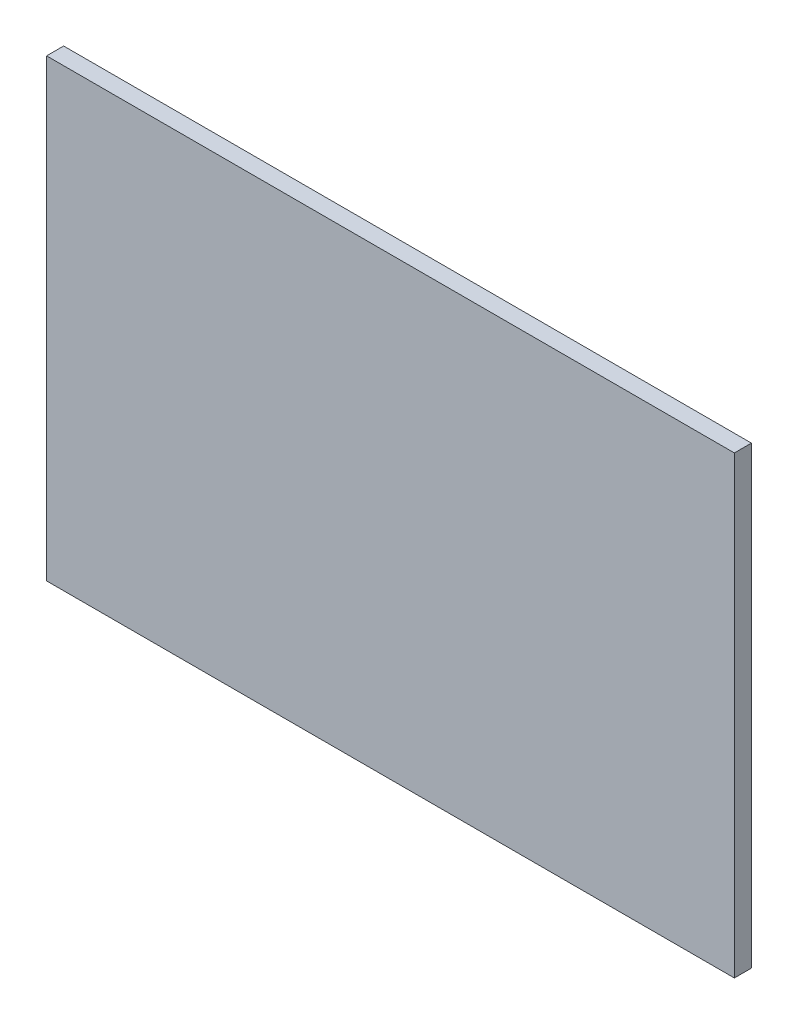
ISO-10303-21;
HEADER;
FILE_DESCRIPTION(('STEP AP214'),'2;1');
FILE_NAME('part.step','',(''),(''),'','','');
FILE_SCHEMA(('AUTOMOTIVE_DESIGN { 1 0 10303 214 1 1 1 1 }'));
ENDSEC;
DATA;
#1=APPLICATION_CONTEXT('core data for automotive mechanical design processes');
#2=APPLICATION_PROTOCOL_DEFINITION('international standard','automotive_design',2000,#1);
#3=PRODUCT_CONTEXT('',#1,'mechanical');
#4=PRODUCT('Part','Part','',(#3));
#5=PRODUCT_RELATED_PRODUCT_CATEGORY('part','',(#4));
#6=PRODUCT_DEFINITION_FORMATION('','',#4);
#7=PRODUCT_DEFINITION_CONTEXT('part definition',#1,'design');
#8=PRODUCT_DEFINITION('design','',#6,#7);
#9=PRODUCT_DEFINITION_SHAPE('','',#8);
#10=(LENGTH_UNIT() NAMED_UNIT(*) SI_UNIT(.MILLI.,.METRE.));
#11=(NAMED_UNIT(*) PLANE_ANGLE_UNIT() SI_UNIT($,.RADIAN.));
#12=(NAMED_UNIT(*) SI_UNIT($,.STERADIAN.) SOLID_ANGLE_UNIT());
#13=UNCERTAINTY_MEASURE_WITH_UNIT(LENGTH_MEASURE(1.E-05),#10,'distance_accuracy_value','');
#14=(GEOMETRIC_REPRESENTATION_CONTEXT(3) GLOBAL_UNCERTAINTY_ASSIGNED_CONTEXT((#13)) GLOBAL_UNIT_ASSIGNED_CONTEXT((#10,
#11,#12)) REPRESENTATION_CONTEXT('',''));
#15=CARTESIAN_POINT('',(0.,0.,0.));
#16=DIRECTION('',(0.,0.,1.));
#17=DIRECTION('',(1.,0.,0.));
#18=AXIS2_PLACEMENT_3D('',#15,#16,#17);
#19=CARTESIAN_POINT('',(-56.5061814699281,29.1193601788599,3.));
#20=DIRECTION('',(1.,0.,0.));
#21=DIRECTION('',(0.,0.,-1.));
#22=AXIS2_PLACEMENT_3D('',#19,#20,#21);
#23=PLANE('',#22);
#24=DIRECTION('',(0.,-1.,0.));
#25=VECTOR('',#24,1.);
#26=CARTESIAN_POINT('',(-56.5061814699281,29.1193601788599,0.));
#27=LINE('',#26,#25);
#28=CARTESIAN_POINT('',(-56.5061814699281,29.1193601788599,0.));
#29=VERTEX_POINT('',#28);
#30=CARTESIAN_POINT('',(-56.5061814699281,-50.8806398211401,0.));
#31=VERTEX_POINT('',#30);
#32=EDGE_CURVE('E96',#29,#31,#27,.T.);
#33=ORIENTED_EDGE('',*,*,#32,.T.);
#34=DIRECTION('',(0.,0.,-1.));
#35=VECTOR('',#34,1.);
#36=CARTESIAN_POINT('',(-56.5061814699281,-50.8806398211401,3.));
#37=LINE('',#36,#35);
#38=CARTESIAN_POINT('',(-56.5061814699281,-50.8806398211401,3.));
#39=VERTEX_POINT('',#38);
#40=EDGE_CURVE('E11',#39,#31,#37,.T.);
#41=ORIENTED_EDGE('',*,*,#40,.F.);
#42=DIRECTION('',(0.,-1.,0.));
#43=VECTOR('',#42,1.);
#44=CARTESIAN_POINT('',(-56.5061814699281,29.1193601788599,3.));
#45=LINE('',#44,#43);
#46=CARTESIAN_POINT('',(-56.5061814699281,29.1193601788599,3.));
#47=VERTEX_POINT('',#46);
#48=EDGE_CURVE('E84',#47,#39,#45,.T.);
#49=ORIENTED_EDGE('',*,*,#48,.F.);
#50=DIRECTION('',(0.,0.,-1.));
#51=VECTOR('',#50,1.);
#52=CARTESIAN_POINT('',(-56.5061814699281,29.1193601788599,3.));
#53=LINE('',#52,#51);
#54=EDGE_CURVE('E92',#47,#29,#53,.T.);
#55=ORIENTED_EDGE('',*,*,#54,.T.);
#56=EDGE_LOOP('',(#33,#41,#49,#55));
#57=FACE_BOUND('',#56,.T.);
#58=ADVANCED_FACE('F33',(#57),#23,.F.);
#59=CARTESIAN_POINT('',(-56.5061814699281,-50.8806398211401,3.));
#60=DIRECTION('',(0.,1.,0.));
#61=DIRECTION('',(-1.,0.,0.));
#62=AXIS2_PLACEMENT_3D('',#59,#60,#61);
#63=PLANE('',#62);
#64=DIRECTION('',(1.,0.,0.));
#65=VECTOR('',#64,1.);
#66=CARTESIAN_POINT('',(-56.5061814699281,-50.8806398211401,0.));
#67=LINE('',#66,#65);
#68=CARTESIAN_POINT('',(64.4938185300719,-50.8806398211401,0.));
#69=VERTEX_POINT('',#68);
#70=EDGE_CURVE('E88',#31,#69,#67,.T.);
#71=ORIENTED_EDGE('',*,*,#70,.T.);
#72=DIRECTION('',(0.,0.,-1.));
#73=VECTOR('',#72,1.);
#74=CARTESIAN_POINT('',(64.4938185300719,-50.8806398211401,3.));
#75=LINE('',#74,#73);
#76=CARTESIAN_POINT('',(64.4938185300719,-50.8806398211401,3.));
#77=VERTEX_POINT('',#76);
#78=EDGE_CURVE('E41',#77,#69,#75,.T.);
#79=ORIENTED_EDGE('',*,*,#78,.F.);
#80=DIRECTION('',(1.,0.,0.));
#81=VECTOR('',#80,1.);
#82=CARTESIAN_POINT('',(-56.5061814699281,-50.8806398211401,3.));
#83=LINE('',#82,#81);
#84=EDGE_CURVE('E79',#39,#77,#83,.T.);
#85=ORIENTED_EDGE('',*,*,#84,.F.);
#86=ORIENTED_EDGE('',*,*,#40,.T.);
#87=EDGE_LOOP('',(#71,#79,#85,#86));
#88=FACE_BOUND('',#87,.T.);
#89=ADVANCED_FACE('F87',(#88),#63,.F.);
#90=CARTESIAN_POINT('',(64.4938185300719,29.1193601788599,3.));
#91=DIRECTION('',(-1.,0.,0.));
#92=DIRECTION('',(0.,0.,1.));
#93=AXIS2_PLACEMENT_3D('',#90,#91,#92);
#94=PLANE('',#93);
#95=DIRECTION('',(0.,1.,0.));
#96=VECTOR('',#95,1.);
#97=CARTESIAN_POINT('',(64.4938185300719,29.1193601788599,0.));
#98=LINE('',#97,#96);
#99=CARTESIAN_POINT('',(64.4938185300719,29.1193601788599,0.));
#100=VERTEX_POINT('',#99);
#101=EDGE_CURVE('E66',#69,#100,#98,.T.);
#102=ORIENTED_EDGE('',*,*,#101,.T.);
#103=DIRECTION('',(0.,0.,-1.));
#104=VECTOR('',#103,1.);
#105=CARTESIAN_POINT('',(64.4938185300719,29.1193601788599,3.));
#106=LINE('',#105,#104);
#107=CARTESIAN_POINT('',(64.4938185300719,29.1193601788599,3.));
#108=VERTEX_POINT('',#107);
#109=EDGE_CURVE('E89',#108,#100,#106,.T.);
#110=ORIENTED_EDGE('',*,*,#109,.F.);
#111=DIRECTION('',(0.,1.,0.));
#112=VECTOR('',#111,1.);
#113=CARTESIAN_POINT('',(64.4938185300719,29.1193601788599,3.));
#114=LINE('',#113,#112);
#115=EDGE_CURVE('E82',#77,#108,#114,.T.);
#116=ORIENTED_EDGE('',*,*,#115,.F.);
#117=ORIENTED_EDGE('',*,*,#78,.T.);
#118=EDGE_LOOP('',(#102,#110,#116,#117));
#119=FACE_BOUND('',#118,.T.);
#120=ADVANCED_FACE('F90',(#119),#94,.F.);
#121=CARTESIAN_POINT('',(-56.5061814699281,29.1193601788599,3.));
#122=DIRECTION('',(0.,-1.,0.));
#123=DIRECTION('',(1.,0.,0.));
#124=AXIS2_PLACEMENT_3D('',#121,#122,#123);
#125=PLANE('',#124);
#126=DIRECTION('',(-1.,0.,0.));
#127=VECTOR('',#126,1.);
#128=CARTESIAN_POINT('',(-56.5061814699281,29.1193601788599,0.));
#129=LINE('',#128,#127);
#130=EDGE_CURVE('E72',#100,#29,#129,.T.);
#131=ORIENTED_EDGE('',*,*,#130,.T.);
#132=ORIENTED_EDGE('',*,*,#54,.F.);
#133=DIRECTION('',(-1.,0.,0.));
#134=VECTOR('',#133,1.);
#135=CARTESIAN_POINT('',(-56.5061814699281,29.1193601788599,3.));
#136=LINE('',#135,#134);
#137=EDGE_CURVE('E49',#108,#47,#136,.T.);
#138=ORIENTED_EDGE('',*,*,#137,.F.);
#139=ORIENTED_EDGE('',*,*,#109,.T.);
#140=EDGE_LOOP('',(#131,#132,#138,#139));
#141=FACE_BOUND('',#140,.T.);
#142=ADVANCED_FACE('F103',(#141),#125,.F.);
#143=CARTESIAN_POINT('',(0.,0.,3.));
#144=DIRECTION('',(0.,0.,1.));
#145=DIRECTION('',(1.,0.,0.));
#146=AXIS2_PLACEMENT_3D('',#143,#144,#145);
#147=PLANE('',#146);
#148=ORIENTED_EDGE('',*,*,#48,.T.);
#149=ORIENTED_EDGE('',*,*,#84,.T.);
#150=ORIENTED_EDGE('',*,*,#115,.T.);
#151=ORIENTED_EDGE('',*,*,#137,.T.);
#152=EDGE_LOOP('',(#148,#149,#150,#151));
#153=FACE_BOUND('',#152,.T.);
#154=ADVANCED_FACE('F80',(#153),#147,.T.);
#155=CARTESIAN_POINT('',(0.,0.,0.));
#156=DIRECTION('',(0.,0.,1.));
#157=DIRECTION('',(1.,0.,0.));
#158=AXIS2_PLACEMENT_3D('',#155,#156,#157);
#159=PLANE('',#158);
#160=ORIENTED_EDGE('',*,*,#32,.F.);
#161=ORIENTED_EDGE('',*,*,#130,.F.);
#162=ORIENTED_EDGE('',*,*,#101,.F.);
#163=ORIENTED_EDGE('',*,*,#70,.F.);
#164=EDGE_LOOP('',(#160,#161,#162,#163));
#165=FACE_BOUND('',#164,.T.);
#166=ADVANCED_FACE('F106',(#165),#159,.F.);
#167=CLOSED_SHELL('',(#58,#89,#120,#142,#154,#166));
#168=MANIFOLD_SOLID_BREP('B2',#167);
#169=ADVANCED_BREP_SHAPE_REPRESENTATION('',(#18,#168),#14);
#170=SHAPE_DEFINITION_REPRESENTATION(#9,#169);
ENDSEC;
END-ISO-10303-21;
